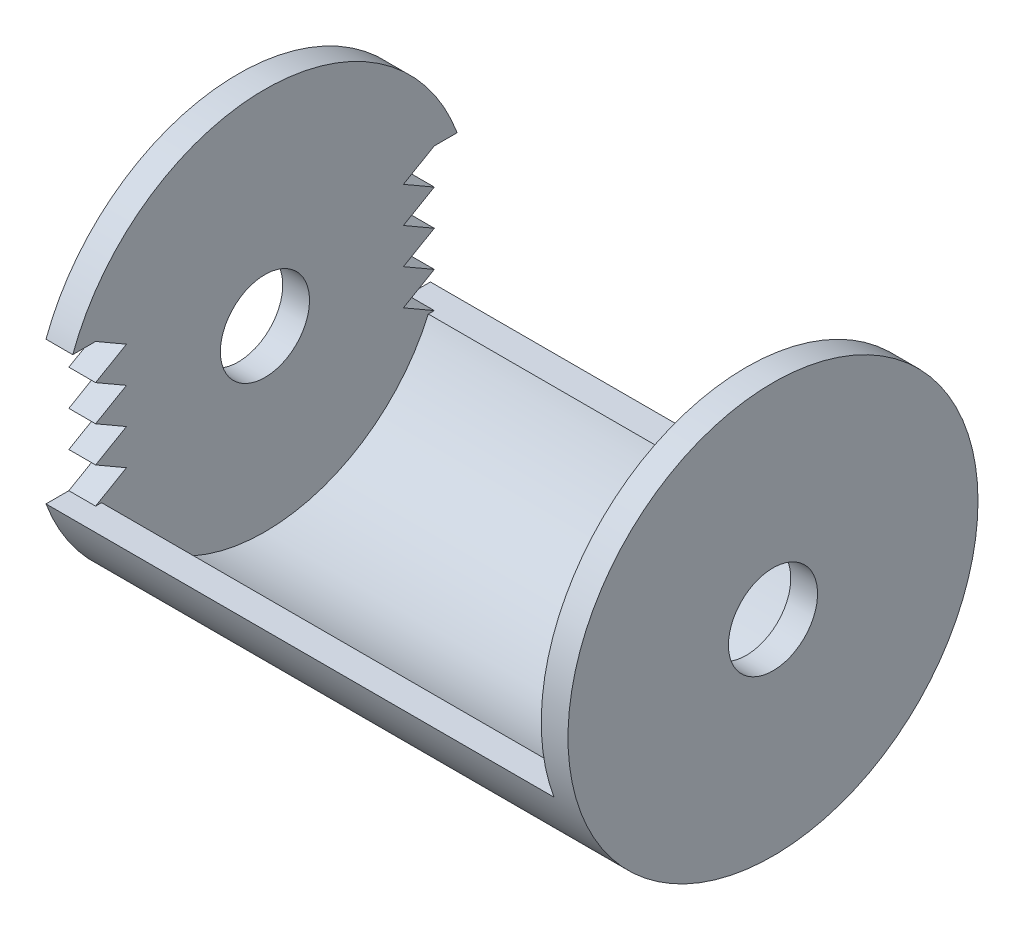
ISO-10303-21;
HEADER;
FILE_DESCRIPTION(('STEP AP214'),'2;1');
FILE_NAME('part.step','',(''),(''),'','','');
FILE_SCHEMA(('AUTOMOTIVE_DESIGN { 1 0 10303 214 1 1 1 1 }'));
ENDSEC;
DATA;
#1=APPLICATION_CONTEXT('core data for automotive mechanical design processes');
#2=APPLICATION_PROTOCOL_DEFINITION('international standard','automotive_design',2000,#1);
#3=PRODUCT_CONTEXT('',#1,'mechanical');
#4=PRODUCT('Part','Part','',(#3));
#5=PRODUCT_RELATED_PRODUCT_CATEGORY('part','',(#4));
#6=PRODUCT_DEFINITION_FORMATION('','',#4);
#7=PRODUCT_DEFINITION_CONTEXT('part definition',#1,'design');
#8=PRODUCT_DEFINITION('design','',#6,#7);
#9=PRODUCT_DEFINITION_SHAPE('','',#8);
#10=(LENGTH_UNIT() NAMED_UNIT(*) SI_UNIT(.MILLI.,.METRE.));
#11=(NAMED_UNIT(*) PLANE_ANGLE_UNIT() SI_UNIT($,.RADIAN.));
#12=(NAMED_UNIT(*) SI_UNIT($,.STERADIAN.) SOLID_ANGLE_UNIT());
#13=UNCERTAINTY_MEASURE_WITH_UNIT(LENGTH_MEASURE(1.E-05),#10,'distance_accuracy_value','');
#14=(GEOMETRIC_REPRESENTATION_CONTEXT(3) GLOBAL_UNCERTAINTY_ASSIGNED_CONTEXT((#13)) GLOBAL_UNIT_ASSIGNED_CONTEXT((#10,
#11,#12)) REPRESENTATION_CONTEXT('',''));
#15=CARTESIAN_POINT('',(0.,0.,0.));
#16=DIRECTION('',(0.,0.,1.));
#17=DIRECTION('',(1.,0.,0.));
#18=AXIS2_PLACEMENT_3D('',#15,#16,#17);
#19=CARTESIAN_POINT('',(0.,0.,0.));
#20=DIRECTION('',(1.,0.,0.));
#21=DIRECTION('',(0.,0.,-1.));
#22=AXIS2_PLACEMENT_3D('',#19,#20,#21);
#23=PLANE('',#22);
#24=CARTESIAN_POINT('',(0.,0.,0.));
#25=DIRECTION('',(1.,0.,0.));
#26=DIRECTION('',(0.,0.,-1.));
#27=AXIS2_PLACEMENT_3D('',#24,#25,#26);
#28=CIRCLE('',#27,6.35);
#29=CARTESIAN_POINT('',(0.,0.,6.35));
#30=VERTEX_POINT('',#29);
#31=EDGE_CURVE('E246',#30,#30,#28,.T.);
#32=ORIENTED_EDGE('',*,*,#31,.T.);
#33=EDGE_LOOP('',(#32));
#34=FACE_BOUND('',#33,.T.);
#35=DIRECTION('',(0.,0.,-1.));
#36=VECTOR('',#35,1.);
#37=CARTESIAN_POINT('',(0.,10.16,29.21));
#38=LINE('',#37,#36);
#39=CARTESIAN_POINT('',(0.,10.16,27.3861004891167));
#40=VERTEX_POINT('',#39);
#41=CARTESIAN_POINT('',(0.,10.16,24.13));
#42=VERTEX_POINT('',#41);
#43=EDGE_CURVE('E210',#40,#42,#38,.T.);
#44=ORIENTED_EDGE('',*,*,#43,.F.);
#45=CARTESIAN_POINT('',(0.,0.,0.));
#46=DIRECTION('',(1.,0.,0.));
#47=DIRECTION('',(0.,0.,-1.));
#48=AXIS2_PLACEMENT_3D('',#45,#46,#47);
#49=CIRCLE('',#48,29.21);
#50=CARTESIAN_POINT('',(0.,10.16,-27.3861004891167));
#51=VERTEX_POINT('',#50);
#52=EDGE_CURVE('E256',#51,#40,#49,.T.);
#53=ORIENTED_EDGE('',*,*,#52,.F.);
#54=DIRECTION('',(0.,0.,-1.));
#55=VECTOR('',#54,1.);
#56=CARTESIAN_POINT('',(0.,10.16,-29.21));
#57=LINE('',#56,#55);
#58=CARTESIAN_POINT('',(0.,10.16,-24.13));
#59=VERTEX_POINT('',#58);
#60=EDGE_CURVE('E308',#59,#51,#57,.T.);
#61=ORIENTED_EDGE('',*,*,#60,.F.);
#62=DIRECTION('',(0.,0.5,-0.866025403784439));
#63=VECTOR('',#62,1.);
#64=CARTESIAN_POINT('',(0.,10.16,-24.13));
#65=LINE('',#64,#63);
#66=CARTESIAN_POINT('',(0.,7.61999999999999,-19.730590948775));
#67=VERTEX_POINT('',#66);
#68=EDGE_CURVE('E402',#67,#59,#65,.T.);
#69=ORIENTED_EDGE('',*,*,#68,.F.);
#70=DIRECTION('',(0.,0.5,0.866025403784439));
#71=VECTOR('',#70,1.);
#72=CARTESIAN_POINT('',(0.,7.61999999999999,-19.730590948775));
#73=LINE('',#72,#71);
#74=CARTESIAN_POINT('',(0.,5.07999999999999,-24.13));
#75=VERTEX_POINT('',#74);
#76=EDGE_CURVE('E404',#75,#67,#73,.T.);
#77=ORIENTED_EDGE('',*,*,#76,.F.);
#78=DIRECTION('',(0.,0.5,-0.866025403784439));
#79=VECTOR('',#78,1.);
#80=CARTESIAN_POINT('',(0.,5.07999999999999,-24.13));
#81=LINE('',#80,#79);
#82=CARTESIAN_POINT('',(0.,2.53999999999999,-19.730590948775));
#83=VERTEX_POINT('',#82);
#84=EDGE_CURVE('E406',#83,#75,#81,.T.);
#85=ORIENTED_EDGE('',*,*,#84,.F.);
#86=DIRECTION('',(0.,0.5,0.866025403784439));
#87=VECTOR('',#86,1.);
#88=CARTESIAN_POINT('',(0.,2.53999999999999,-19.730590948775));
#89=LINE('',#88,#87);
#90=CARTESIAN_POINT('',(0.,0.,-24.13));
#91=VERTEX_POINT('',#90);
#92=EDGE_CURVE('E407',#91,#83,#89,.T.);
#93=ORIENTED_EDGE('',*,*,#92,.F.);
#94=DIRECTION('',(0.,0.499999999999999,-0.866025403784439));
#95=VECTOR('',#94,1.);
#96=CARTESIAN_POINT('',(0.,0.,-24.13));
#97=LINE('',#96,#95);
#98=CARTESIAN_POINT('',(0.,-2.54,-19.730590948775));
#99=VERTEX_POINT('',#98);
#100=EDGE_CURVE('E414',#99,#91,#97,.T.);
#101=ORIENTED_EDGE('',*,*,#100,.F.);
#102=DIRECTION('',(0.,0.5,0.866025403784439));
#103=VECTOR('',#102,1.);
#104=CARTESIAN_POINT('',(0.,-2.54,-19.730590948775));
#105=LINE('',#104,#103);
#106=CARTESIAN_POINT('',(0.,-5.08,-24.13));
#107=VERTEX_POINT('',#106);
#108=EDGE_CURVE('E418',#107,#99,#105,.T.);
#109=ORIENTED_EDGE('',*,*,#108,.F.);
#110=DIRECTION('',(0.,0.5,-0.866025403784439));
#111=VECTOR('',#110,1.);
#112=CARTESIAN_POINT('',(0.,-5.08,-24.13));
#113=LINE('',#112,#111);
#114=CARTESIAN_POINT('',(0.,-7.62,-19.730590948775));
#115=VERTEX_POINT('',#114);
#116=EDGE_CURVE('E282',#115,#107,#113,.T.);
#117=ORIENTED_EDGE('',*,*,#116,.F.);
#118=DIRECTION('',(0.,0.5,0.866025403784439));
#119=VECTOR('',#118,1.);
#120=CARTESIAN_POINT('',(0.,-7.62,-19.730590948775));
#121=LINE('',#120,#119);
#122=CARTESIAN_POINT('',(0.,-10.16,-24.13));
#123=VERTEX_POINT('',#122);
#124=EDGE_CURVE('E276',#123,#115,#121,.T.);
#125=ORIENTED_EDGE('',*,*,#124,.F.);
#126=DIRECTION('',(0.,0.,1.));
#127=VECTOR('',#126,1.);
#128=CARTESIAN_POINT('',(0.,-10.16,-24.13));
#129=LINE('',#128,#127);
#130=CARTESIAN_POINT('',(0.,-10.16,-27.3861004891167));
#131=VERTEX_POINT('',#130);
#132=EDGE_CURVE('E267',#131,#123,#129,.T.);
#133=ORIENTED_EDGE('',*,*,#132,.F.);
#134=CARTESIAN_POINT('',(0.,-10.16,27.3861004891167));
#135=VERTEX_POINT('',#134);
#136=EDGE_CURVE('E249',#135,#131,#49,.T.);
#137=ORIENTED_EDGE('',*,*,#136,.F.);
#138=DIRECTION('',(0.,0.,1.));
#139=VECTOR('',#138,1.);
#140=CARTESIAN_POINT('',(0.,-10.16,24.13));
#141=LINE('',#140,#139);
#142=CARTESIAN_POINT('',(0.,-10.16,24.13));
#143=VERTEX_POINT('',#142);
#144=EDGE_CURVE('E219',#143,#135,#141,.T.);
#145=ORIENTED_EDGE('',*,*,#144,.F.);
#146=DIRECTION('',(0.,-0.5,0.866025403784439));
#147=VECTOR('',#146,1.);
#148=CARTESIAN_POINT('',(0.,-7.62,19.7305909487751));
#149=LINE('',#148,#147);
#150=CARTESIAN_POINT('',(0.,-7.62,19.7305909487751));
#151=VERTEX_POINT('',#150);
#152=EDGE_CURVE('E366',#151,#143,#149,.T.);
#153=ORIENTED_EDGE('',*,*,#152,.F.);
#154=DIRECTION('',(0.,-0.5,-0.866025403784439));
#155=VECTOR('',#154,1.);
#156=CARTESIAN_POINT('',(0.,-5.08,24.13));
#157=LINE('',#156,#155);
#158=CARTESIAN_POINT('',(0.,-5.08,24.13));
#159=VERTEX_POINT('',#158);
#160=EDGE_CURVE('E361',#159,#151,#157,.T.);
#161=ORIENTED_EDGE('',*,*,#160,.F.);
#162=DIRECTION('',(0.,-0.5,0.866025403784439));
#163=VECTOR('',#162,1.);
#164=CARTESIAN_POINT('',(0.,-2.54,19.7305909487751));
#165=LINE('',#164,#163);
#166=CARTESIAN_POINT('',(0.,-2.54,19.7305909487751));
#167=VERTEX_POINT('',#166);
#168=EDGE_CURVE('E359',#167,#159,#165,.T.);
#169=ORIENTED_EDGE('',*,*,#168,.F.);
#170=DIRECTION('',(0.,-0.5,-0.866025403784439));
#171=VECTOR('',#170,1.);
#172=CARTESIAN_POINT('',(0.,0.,24.13));
#173=LINE('',#172,#171);
#174=CARTESIAN_POINT('',(0.,0.,24.13));
#175=VERTEX_POINT('',#174);
#176=EDGE_CURVE('E357',#175,#167,#173,.T.);
#177=ORIENTED_EDGE('',*,*,#176,.F.);
#178=DIRECTION('',(0.,-0.5,0.866025403784439));
#179=VECTOR('',#178,1.);
#180=CARTESIAN_POINT('',(0.,2.54,19.7305909487751));
#181=LINE('',#180,#179);
#182=CARTESIAN_POINT('',(0.,2.54,19.7305909487751));
#183=VERTEX_POINT('',#182);
#184=EDGE_CURVE('E355',#183,#175,#181,.T.);
#185=ORIENTED_EDGE('',*,*,#184,.F.);
#186=DIRECTION('',(0.,-0.5,-0.866025403784439));
#187=VECTOR('',#186,1.);
#188=CARTESIAN_POINT('',(0.,5.08,24.13));
#189=LINE('',#188,#187);
#190=CARTESIAN_POINT('',(0.,5.08,24.13));
#191=VERTEX_POINT('',#190);
#192=EDGE_CURVE('E353',#191,#183,#189,.T.);
#193=ORIENTED_EDGE('',*,*,#192,.F.);
#194=DIRECTION('',(0.,-0.5,0.866025403784439));
#195=VECTOR('',#194,1.);
#196=CARTESIAN_POINT('',(0.,7.62,19.7305909487751));
#197=LINE('',#196,#195);
#198=CARTESIAN_POINT('',(0.,7.62,19.7305909487751));
#199=VERTEX_POINT('',#198);
#200=EDGE_CURVE('E349',#199,#191,#197,.T.);
#201=ORIENTED_EDGE('',*,*,#200,.F.);
#202=DIRECTION('',(0.,-0.5,-0.866025403784439));
#203=VECTOR('',#202,1.);
#204=CARTESIAN_POINT('',(0.,10.16,24.13));
#205=LINE('',#204,#203);
#206=EDGE_CURVE('E278',#42,#199,#205,.T.);
#207=ORIENTED_EDGE('',*,*,#206,.F.);
#208=EDGE_LOOP('',(#44,#53,#61,#69,#77,#85,#93,#101,#109,#117,#125,#133,#137,#145,#153,#161,
#169,#177,#185,#193,#201,#207));
#209=FACE_BOUND('',#208,.T.);
#210=ADVANCED_FACE('F41',(#34,#209),#23,.F.);
#211=CARTESIAN_POINT('',(76.2,0.,0.));
#212=DIRECTION('',(-1.,0.,0.));
#213=DIRECTION('',(0.,0.,1.));
#214=AXIS2_PLACEMENT_3D('',#211,#212,#213);
#215=CYLINDRICAL_SURFACE('',#214,29.21);
#216=ORIENTED_EDGE('',*,*,#52,.T.);
#217=DIRECTION('',(-1.,0.,0.));
#218=VECTOR('',#217,1.);
#219=CARTESIAN_POINT('',(76.2,10.16,27.3861004891167));
#220=LINE('',#219,#218);
#221=CARTESIAN_POINT('',(3.81,10.16,27.3861004891167));
#222=VERTEX_POINT('',#221);
#223=EDGE_CURVE('E311',#40,#222,#220,.F.);
#224=ORIENTED_EDGE('',*,*,#223,.T.);
#225=CARTESIAN_POINT('',(3.81000000000001,0.,0.));
#226=DIRECTION('',(-1.,0.,0.));
#227=DIRECTION('',(0.,-1.,0.));
#228=AXIS2_PLACEMENT_3D('',#225,#226,#227);
#229=CIRCLE('',#228,29.21);
#230=CARTESIAN_POINT('',(3.81,10.16,-27.3861004891167));
#231=VERTEX_POINT('',#230);
#232=EDGE_CURVE('E221',#222,#231,#229,.T.);
#233=ORIENTED_EDGE('',*,*,#232,.T.);
#234=DIRECTION('',(-1.,0.,0.));
#235=VECTOR('',#234,1.);
#236=CARTESIAN_POINT('',(76.2,10.16,-27.3861004891167));
#237=LINE('',#236,#235);
#238=EDGE_CURVE('E307',#231,#51,#237,.T.);
#239=ORIENTED_EDGE('',*,*,#238,.T.);
#240=EDGE_LOOP('',(#216,#224,#233,#239));
#241=FACE_BOUND('',#240,.T.);
#242=ADVANCED_FACE('F442',(#241),#215,.T.);
#243=CARTESIAN_POINT('',(3.81,-10.16,-29.21));
#244=DIRECTION('',(0.,-1.,0.));
#245=DIRECTION('',(0.,0.,-1.));
#246=AXIS2_PLACEMENT_3D('',#243,#244,#245);
#247=PLANE('',#246);
#248=DIRECTION('',(0.,0.,1.));
#249=VECTOR('',#248,1.);
#250=CARTESIAN_POINT('',(72.39,-10.16,-29.21));
#251=LINE('',#250,#249);
#252=CARTESIAN_POINT('',(72.39,-10.16,23.2794845303757));
#253=VERTEX_POINT('',#252);
#254=CARTESIAN_POINT('',(72.39,-10.16,27.3861004891167));
#255=VERTEX_POINT('',#254);
#256=EDGE_CURVE('E323',#253,#255,#251,.T.);
#257=ORIENTED_EDGE('',*,*,#256,.F.);
#258=DIRECTION('',(-1.,0.,0.));
#259=VECTOR('',#258,1.);
#260=CARTESIAN_POINT('',(76.2,-10.16,23.2794845303757));
#261=LINE('',#260,#259);
#262=CARTESIAN_POINT('',(3.81000000000001,-10.16,23.2794845303757));
#263=VERTEX_POINT('',#262);
#264=EDGE_CURVE('E320',#253,#263,#261,.T.);
#265=ORIENTED_EDGE('',*,*,#264,.T.);
#266=DIRECTION('',(0.,0.,1.));
#267=VECTOR('',#266,1.);
#268=CARTESIAN_POINT('',(3.81,-10.16,-29.21));
#269=LINE('',#268,#267);
#270=CARTESIAN_POINT('',(3.81,-10.16,24.13));
#271=VERTEX_POINT('',#270);
#272=EDGE_CURVE('E321',#263,#271,#269,.T.);
#273=ORIENTED_EDGE('',*,*,#272,.T.);
#274=DIRECTION('',(-1.,0.,0.));
#275=VECTOR('',#274,1.);
#276=CARTESIAN_POINT('',(3.81,-10.16,24.13));
#277=LINE('',#276,#275);
#278=EDGE_CURVE('E315',#271,#143,#277,.T.);
#279=ORIENTED_EDGE('',*,*,#278,.T.);
#280=ORIENTED_EDGE('',*,*,#144,.T.);
#281=DIRECTION('',(-1.,0.,0.));
#282=VECTOR('',#281,1.);
#283=CARTESIAN_POINT('',(76.2,-10.16,27.3861004891167));
#284=LINE('',#283,#282);
#285=EDGE_CURVE('E259',#255,#135,#284,.T.);
#286=ORIENTED_EDGE('',*,*,#285,.F.);
#287=EDGE_LOOP('',(#257,#265,#273,#279,#280,#286));
#288=FACE_BOUND('',#287,.T.);
#289=ADVANCED_FACE('F333',(#288),#247,.F.);
#290=CARTESIAN_POINT('',(76.2,0.,0.));
#291=DIRECTION('',(-1.,0.,0.));
#292=DIRECTION('',(0.,0.,1.));
#293=AXIS2_PLACEMENT_3D('',#290,#291,#292);
#294=CYLINDRICAL_SURFACE('',#293,6.35);
#295=CARTESIAN_POINT('',(72.39,0.,0.));
#296=DIRECTION('',(1.,0.,0.));
#297=DIRECTION('',(0.,0.,-1.));
#298=AXIS2_PLACEMENT_3D('',#295,#296,#297);
#299=CIRCLE('',#298,6.35);
#300=CARTESIAN_POINT('',(72.39,0.,6.35));
#301=VERTEX_POINT('',#300);
#302=EDGE_CURVE('E233',#301,#301,#299,.T.);
#303=CARTESIAN_POINT('',(76.2,0.,0.));
#304=DIRECTION('',(1.,0.,0.));
#305=DIRECTION('',(0.,0.,-1.));
#306=AXIS2_PLACEMENT_3D('',#303,#304,#305);
#307=CIRCLE('',#306,6.35);
#308=CARTESIAN_POINT('',(76.2,0.,6.35));
#309=VERTEX_POINT('',#308);
#310=EDGE_CURVE('E250',#309,#309,#307,.T.);
#311=CARTESIAN_POINT('',(72.39,0.,6.35));
#312=CARTESIAN_POINT('',(72.4296875,0.,6.35));
#313=CARTESIAN_POINT('',(72.469375,0.,6.35));
#314=CARTESIAN_POINT('',(72.54875,0.,6.35));
#315=CARTESIAN_POINT('',(72.5884375,0.,6.35));
#316=CARTESIAN_POINT('',(72.6678125,0.,6.35));
#317=CARTESIAN_POINT('',(72.7075,0.,6.35));
#318=CARTESIAN_POINT('',(72.786875,0.,6.35));
#319=CARTESIAN_POINT('',(72.8265625,0.,6.35));
#320=CARTESIAN_POINT('',(72.9059375,0.,6.35));
#321=CARTESIAN_POINT('',(72.945625,0.,6.35));
#322=CARTESIAN_POINT('',(73.025,0.,6.35));
#323=CARTESIAN_POINT('',(73.0646875,0.,6.35));
#324=CARTESIAN_POINT('',(73.1440625,0.,6.35));
#325=CARTESIAN_POINT('',(73.18375,0.,6.35));
#326=CARTESIAN_POINT('',(73.263125,0.,6.35));
#327=CARTESIAN_POINT('',(73.3028125,0.,6.35));
#328=CARTESIAN_POINT('',(73.3821875,0.,6.35));
#329=CARTESIAN_POINT('',(73.421875,0.,6.35));
#330=CARTESIAN_POINT('',(73.50125,0.,6.35));
#331=CARTESIAN_POINT('',(73.5409375,0.,6.35));
#332=CARTESIAN_POINT('',(73.6203125,0.,6.35));
#333=CARTESIAN_POINT('',(73.66,0.,6.35));
#334=CARTESIAN_POINT('',(73.739375,0.,6.35));
#335=CARTESIAN_POINT('',(73.7790625,0.,6.35));
#336=CARTESIAN_POINT('',(73.8584375,0.,6.35));
#337=CARTESIAN_POINT('',(73.898125,0.,6.35));
#338=CARTESIAN_POINT('',(73.9775,0.,6.35));
#339=CARTESIAN_POINT('',(74.0171875,0.,6.35));
#340=CARTESIAN_POINT('',(74.0965625,0.,6.35));
#341=CARTESIAN_POINT('',(74.13625,0.,6.35));
#342=CARTESIAN_POINT('',(74.215625,0.,6.35));
#343=CARTESIAN_POINT('',(74.2553125,0.,6.35));
#344=CARTESIAN_POINT('',(74.3346875,0.,6.35));
#345=CARTESIAN_POINT('',(74.374375,0.,6.35));
#346=CARTESIAN_POINT('',(74.45375,0.,6.35));
#347=CARTESIAN_POINT('',(74.4934375,0.,6.35));
#348=CARTESIAN_POINT('',(74.5728125,0.,6.35));
#349=CARTESIAN_POINT('',(74.6125,0.,6.35));
#350=CARTESIAN_POINT('',(74.691875,0.,6.35));
#351=CARTESIAN_POINT('',(74.7315625,0.,6.35));
#352=CARTESIAN_POINT('',(74.8109375,0.,6.35));
#353=CARTESIAN_POINT('',(74.850625,0.,6.35));
#354=CARTESIAN_POINT('',(74.93,0.,6.35));
#355=CARTESIAN_POINT('',(74.9696875,0.,6.35));
#356=CARTESIAN_POINT('',(75.0490625,0.,6.35));
#357=CARTESIAN_POINT('',(75.08875,0.,6.35));
#358=CARTESIAN_POINT('',(75.168125,0.,6.35));
#359=CARTESIAN_POINT('',(75.2078125,0.,6.35));
#360=CARTESIAN_POINT('',(75.2871875,0.,6.35));
#361=CARTESIAN_POINT('',(75.326875,0.,6.35));
#362=CARTESIAN_POINT('',(75.40625,0.,6.35));
#363=CARTESIAN_POINT('',(75.4459375,0.,6.35));
#364=CARTESIAN_POINT('',(75.5253125,0.,6.35));
#365=CARTESIAN_POINT('',(75.565,0.,6.35));
#366=CARTESIAN_POINT('',(75.644375,0.,6.35));
#367=CARTESIAN_POINT('',(75.6840625,0.,6.35));
#368=CARTESIAN_POINT('',(75.7634375,0.,6.35));
#369=CARTESIAN_POINT('',(75.803125,0.,6.35));
#370=CARTESIAN_POINT('',(75.8825,0.,6.35));
#371=CARTESIAN_POINT('',(75.9221875,0.,6.35));
#372=CARTESIAN_POINT('',(76.0015625,0.,6.35));
#373=CARTESIAN_POINT('',(76.04125,0.,6.35));
#374=CARTESIAN_POINT('',(76.120625,0.,6.35));
#375=CARTESIAN_POINT('',(76.1603125,0.,6.35));
#376=CARTESIAN_POINT('',(76.2,0.,6.35));
#377=B_SPLINE_CURVE_WITH_KNOTS('',3,(#311,#312,#313,#314,#315,#316,#317,#318,#319,#320,#321,
#322,#323,#324,#325,#326,#327,#328,#329,#330,#331,#332,#333,#334,#335,#336,#337,#338,#339,#340,
#341,#342,#343,#344,#345,#346,#347,#348,#349,#350,#351,#352,#353,#354,#355,#356,#357,#358,#359,
#360,#361,#362,#363,#364,#365,#366,#367,#368,#369,#370,#371,#372,#373,#374,#375,#376),
.UNSPECIFIED.,.F.,.F.,(4,2,2,2,2,2,2,2,2,2,2,2,2,2,2,2,2,2,2,2,2,2,2,2,2,2,2,2,2,2,2,2,4),(0.,
0.119062499999989,0.238124999999992,0.357187499999995,0.476249999999998,0.5953125,
0.714374999999989,0.833437499999992,0.952499999999995,1.0715625,1.190625,1.30968749999999,
1.42874999999999,1.5478125,1.666875,1.7859375,1.905,2.02406249999999,2.143125,2.2621875,2.38125,
2.5003125,2.61937499999999,2.7384375,2.8575,2.9765625,3.095625,3.21468749999999,3.33375,
3.4528125,3.571875,3.6909375,3.81000000000001),.UNSPECIFIED.);
#378=EDGE_CURVE('BSEAM455',#301,#309,#377,.T.);
#379=ORIENTED_EDGE('',*,*,#302,.F.);
#380=ORIENTED_EDGE('',*,*,#310,.T.);
#381=ORIENTED_EDGE('',*,*,#378,.T.);
#382=ORIENTED_EDGE('',*,*,#378,.F.);
#383=EDGE_LOOP('',(#379,#381,#380,#382));
#384=FACE_BOUND('',#383,.T.);
#385=ADVANCED_FACE('F455',(#384),#294,.F.);
#386=CARTESIAN_POINT('',(76.2,0.,0.));
#387=DIRECTION('',(1.,0.,0.));
#388=DIRECTION('',(0.,0.,-1.));
#389=AXIS2_PLACEMENT_3D('',#386,#387,#388);
#390=PLANE('',#389);
#391=CARTESIAN_POINT('',(76.2,0.,0.));
#392=DIRECTION('',(1.,0.,0.));
#393=DIRECTION('',(0.,0.,-1.));
#394=AXIS2_PLACEMENT_3D('',#391,#392,#393);
#395=CIRCLE('',#394,29.21);
#396=CARTESIAN_POINT('',(76.2,0.,-29.21));
#397=VERTEX_POINT('',#396);
#398=EDGE_CURVE('E254',#397,#397,#395,.T.);
#399=ORIENTED_EDGE('',*,*,#398,.T.);
#400=EDGE_LOOP('',(#399));
#401=FACE_BOUND('',#400,.T.);
#402=ORIENTED_EDGE('',*,*,#310,.F.);
#403=EDGE_LOOP('',(#402));
#404=FACE_BOUND('',#403,.T.);
#405=ADVANCED_FACE('F448',(#401,#404),#390,.T.);
#406=ORIENTED_EDGE('',*,*,#398,.F.);
#407=EDGE_LOOP('',(#406));
#408=FACE_BOUND('',#407,.T.);
#409=ORIENTED_EDGE('',*,*,#285,.T.);
#410=ORIENTED_EDGE('',*,*,#136,.T.);
#411=DIRECTION('',(-1.,0.,0.));
#412=VECTOR('',#411,1.);
#413=CARTESIAN_POINT('',(76.2,-10.16,-27.3861004891167));
#414=LINE('',#413,#412);
#415=CARTESIAN_POINT('',(72.39,-10.16,-27.3861004891167));
#416=VERTEX_POINT('',#415);
#417=EDGE_CURVE('E44',#131,#416,#414,.F.);
#418=ORIENTED_EDGE('',*,*,#417,.T.);
#419=CARTESIAN_POINT('',(72.39,0.,0.));
#420=DIRECTION('',(1.,0.,0.));
#421=DIRECTION('',(0.,0.,-1.));
#422=AXIS2_PLACEMENT_3D('',#419,#420,#421);
#423=CIRCLE('',#422,29.21);
#424=EDGE_CURVE('E232',#416,#255,#423,.T.);
#425=ORIENTED_EDGE('',*,*,#424,.T.);
#426=EDGE_LOOP('',(#409,#410,#418,#425));
#427=FACE_BOUND('',#426,.T.);
#428=ADVANCED_FACE('F43',(#408,#427),#215,.T.);
#429=CARTESIAN_POINT('',(3.81000000000001,0.,0.));
#430=DIRECTION('',(-1.,0.,0.));
#431=DIRECTION('',(0.,-1.,0.));
#432=AXIS2_PLACEMENT_3D('',#429,#430,#431);
#433=CIRCLE('',#432,6.35);
#434=CARTESIAN_POINT('',(3.81000000000001,0.,6.35));
#435=VERTEX_POINT('',#434);
#436=EDGE_CURVE('E235',#435,#435,#433,.T.);
#437=CARTESIAN_POINT('',(3.81000000000001,0.,6.35));
#438=CARTESIAN_POINT('',(3.77031250000001,0.,6.35));
#439=CARTESIAN_POINT('',(3.73062500000001,0.,6.35));
#440=CARTESIAN_POINT('',(3.65125,0.,6.35));
#441=CARTESIAN_POINT('',(3.6115625,0.,6.35));
#442=CARTESIAN_POINT('',(3.53218750000001,0.,6.35));
#443=CARTESIAN_POINT('',(3.49250000000001,0.,6.35));
#444=CARTESIAN_POINT('',(3.41312500000001,0.,6.35));
#445=CARTESIAN_POINT('',(3.37343750000001,0.,6.35));
#446=CARTESIAN_POINT('',(3.29406250000001,0.,6.35));
#447=CARTESIAN_POINT('',(3.25437500000001,0.,6.35));
#448=CARTESIAN_POINT('',(3.17500000000001,0.,6.35));
#449=CARTESIAN_POINT('',(3.13531250000001,0.,6.35));
#450=CARTESIAN_POINT('',(3.0559375,0.,6.35));
#451=CARTESIAN_POINT('',(3.01625,0.,6.35));
#452=CARTESIAN_POINT('',(2.93687500000001,0.,6.35));
#453=CARTESIAN_POINT('',(2.89718750000001,0.,6.35));
#454=CARTESIAN_POINT('',(2.81781250000001,0.,6.35));
#455=CARTESIAN_POINT('',(2.77812500000001,0.,6.35));
#456=CARTESIAN_POINT('',(2.69875000000001,0.,6.35));
#457=CARTESIAN_POINT('',(2.65906250000001,0.,6.35));
#458=CARTESIAN_POINT('',(2.57968750000001,0.,6.35));
#459=CARTESIAN_POINT('',(2.54000000000001,0.,6.35));
#460=CARTESIAN_POINT('',(2.460625,0.,6.35));
#461=CARTESIAN_POINT('',(2.4209375,0.,6.35));
#462=CARTESIAN_POINT('',(2.3415625,0.,6.35));
#463=CARTESIAN_POINT('',(2.301875,0.,6.35));
#464=CARTESIAN_POINT('',(2.2225,0.,6.35));
#465=CARTESIAN_POINT('',(2.18281250000001,0.,6.35));
#466=CARTESIAN_POINT('',(2.10343750000001,0.,6.35));
#467=CARTESIAN_POINT('',(2.06375000000001,0.,6.35));
#468=CARTESIAN_POINT('',(1.98437500000001,0.,6.35));
#469=CARTESIAN_POINT('',(1.9446875,0.,6.35));
#470=CARTESIAN_POINT('',(1.8653125,0.,6.35));
#471=CARTESIAN_POINT('',(1.825625,0.,6.35));
#472=CARTESIAN_POINT('',(1.74625,0.,6.35));
#473=CARTESIAN_POINT('',(1.7065625,0.,6.35));
#474=CARTESIAN_POINT('',(1.6271875,0.,6.35));
#475=CARTESIAN_POINT('',(1.58750000000001,0.,6.35));
#476=CARTESIAN_POINT('',(1.50812500000001,0.,6.35));
#477=CARTESIAN_POINT('',(1.46843750000001,0.,6.35));
#478=CARTESIAN_POINT('',(1.38906250000001,0.,6.35));
#479=CARTESIAN_POINT('',(1.349375,0.,6.35));
#480=CARTESIAN_POINT('',(1.27,0.,6.35));
#481=CARTESIAN_POINT('',(1.2303125,0.,6.35));
#482=CARTESIAN_POINT('',(1.1509375,0.,6.35));
#483=CARTESIAN_POINT('',(1.11125,0.,6.35));
#484=CARTESIAN_POINT('',(1.031875,0.,6.35));
#485=CARTESIAN_POINT('',(0.992187499999996,0.,6.35));
#486=CARTESIAN_POINT('',(0.912812499999999,0.,6.35));
#487=CARTESIAN_POINT('',(0.873125000000002,0.,6.35));
#488=CARTESIAN_POINT('',(0.793750000000005,0.,6.35));
#489=CARTESIAN_POINT('',(0.754062500000004,0.,6.35));
#490=CARTESIAN_POINT('',(0.674687500000002,0.,6.35));
#491=CARTESIAN_POINT('',(0.635000000000001,0.,6.35));
#492=CARTESIAN_POINT('',(0.555624999999999,0.,6.35));
#493=CARTESIAN_POINT('',(0.515937499999998,0.,6.35));
#494=CARTESIAN_POINT('',(0.436562499999997,0.,6.35));
#495=CARTESIAN_POINT('',(0.396874999999996,0.,6.35));
#496=CARTESIAN_POINT('',(0.317499999999998,0.,6.35));
#497=CARTESIAN_POINT('',(0.277812500000002,0.,6.35));
#498=CARTESIAN_POINT('',(0.198437500000005,0.,6.35));
#499=CARTESIAN_POINT('',(0.158750000000004,0.,6.35));
#500=CARTESIAN_POINT('',(0.0793750000000019,0.,6.35));
#501=CARTESIAN_POINT('',(0.039687500000001,0.,6.35));
#502=CARTESIAN_POINT('',(0.,0.,6.35));
#503=B_SPLINE_CURVE_WITH_KNOTS('',3,(#437,#438,#439,#440,#441,#442,#443,#444,#445,#446,#447,
#448,#449,#450,#451,#452,#453,#454,#455,#456,#457,#458,#459,#460,#461,#462,#463,#464,#465,#466,
#467,#468,#469,#470,#471,#472,#473,#474,#475,#476,#477,#478,#479,#480,#481,#482,#483,#484,#485,
#486,#487,#488,#489,#490,#491,#492,#493,#494,#495,#496,#497,#498,#499,#500,#501,#502),
.UNSPECIFIED.,.F.,.F.,(4,2,2,2,2,2,2,2,2,2,2,2,2,2,2,2,2,2,2,2,2,2,2,2,2,2,2,2,2,2,2,2,4),(0.,
0.119062500000003,0.238125000000006,0.357187499999995,0.476249999999998,0.5953125,
0.714375000000003,0.833437500000006,0.952499999999995,1.0715625,1.190625,1.3096875,
1.42875000000001,1.54781250000001,1.666875,1.7859375,1.905,2.02406250000001,2.14312500000001,
2.2621875,2.38125,2.5003125,2.61937500000001,2.73843750000001,2.85750000000001,2.9765625,
3.095625,3.21468750000001,3.33375000000001,3.45281250000001,3.571875,3.6909375,
3.81000000000001),.UNSPECIFIED.);
#504=EDGE_CURVE('BSEAM452',#435,#30,#503,.T.);
#505=ORIENTED_EDGE('',*,*,#436,.F.);
#506=ORIENTED_EDGE('',*,*,#31,.F.);
#507=ORIENTED_EDGE('',*,*,#504,.T.);
#508=ORIENTED_EDGE('',*,*,#504,.F.);
#509=EDGE_LOOP('',(#505,#507,#506,#508));
#510=FACE_BOUND('',#509,.T.);
#511=ADVANCED_FACE('F452',(#510),#294,.F.);
#512=ORIENTED_EDGE('',*,*,#417,.F.);
#513=ORIENTED_EDGE('',*,*,#132,.T.);
#514=DIRECTION('',(-1.,0.,0.));
#515=VECTOR('',#514,1.);
#516=CARTESIAN_POINT('',(3.81,-10.16,-24.13));
#517=LINE('',#516,#515);
#518=CARTESIAN_POINT('',(3.81,-10.16,-24.13));
#519=VERTEX_POINT('',#518);
#520=EDGE_CURVE('E289',#519,#123,#517,.T.);
#521=ORIENTED_EDGE('',*,*,#520,.F.);
#522=CARTESIAN_POINT('',(3.81,-10.16,-23.2794845303757));
#523=VERTEX_POINT('',#522);
#524=EDGE_CURVE('E245',#519,#523,#269,.T.);
#525=ORIENTED_EDGE('',*,*,#524,.T.);
#526=DIRECTION('',(-1.,0.,0.));
#527=VECTOR('',#526,1.);
#528=CARTESIAN_POINT('',(0.,-10.16,-23.2794845303757));
#529=LINE('',#528,#527);
#530=CARTESIAN_POINT('',(72.39,-10.16,-23.2794845303757));
#531=VERTEX_POINT('',#530);
#532=EDGE_CURVE('E318',#523,#531,#529,.F.);
#533=ORIENTED_EDGE('',*,*,#532,.T.);
#534=EDGE_CURVE('E238',#416,#531,#251,.T.);
#535=ORIENTED_EDGE('',*,*,#534,.F.);
#536=EDGE_LOOP('',(#512,#513,#521,#525,#533,#535));
#537=FACE_BOUND('',#536,.T.);
#538=ADVANCED_FACE('F269',(#537),#247,.F.);
#539=CARTESIAN_POINT('',(72.39,68.58,-29.21));
#540=DIRECTION('',(1.,0.,0.));
#541=DIRECTION('',(0.,0.,-1.));
#542=AXIS2_PLACEMENT_3D('',#539,#540,#541);
#543=PLANE('',#542);
#544=ORIENTED_EDGE('',*,*,#302,.T.);
#545=EDGE_LOOP('',(#544));
#546=FACE_BOUND('',#545,.T.);
#547=ORIENTED_EDGE('',*,*,#424,.F.);
#548=ORIENTED_EDGE('',*,*,#534,.T.);
#549=CARTESIAN_POINT('',(72.39,0.,0.));
#550=DIRECTION('',(1.,0.,0.));
#551=DIRECTION('',(0.,0.,-1.));
#552=AXIS2_PLACEMENT_3D('',#549,#550,#551);
#553=CIRCLE('',#552,25.4);
#554=EDGE_CURVE('E314',#253,#531,#553,.T.);
#555=ORIENTED_EDGE('',*,*,#554,.F.);
#556=ORIENTED_EDGE('',*,*,#256,.T.);
#557=EDGE_LOOP('',(#547,#548,#555,#556));
#558=FACE_BOUND('',#557,.T.);
#559=ADVANCED_FACE('F456',(#546,#558),#543,.F.);
#560=CARTESIAN_POINT('',(3.80999999999999,68.58,-29.21));
#561=DIRECTION('',(-1.,0.,0.));
#562=DIRECTION('',(0.,-1.,0.));
#563=AXIS2_PLACEMENT_3D('',#560,#561,#562);
#564=PLANE('',#563);
#565=ORIENTED_EDGE('',*,*,#232,.F.);
#566=DIRECTION('',(0.,0.,-1.));
#567=VECTOR('',#566,1.);
#568=CARTESIAN_POINT('',(3.81,10.16,29.21));
#569=LINE('',#568,#567);
#570=CARTESIAN_POINT('',(3.81,10.16,24.13));
#571=VERTEX_POINT('',#570);
#572=EDGE_CURVE('E11',#222,#571,#569,.T.);
#573=ORIENTED_EDGE('',*,*,#572,.T.);
#574=DIRECTION('',(0.,-0.5,-0.866025403784439));
#575=VECTOR('',#574,1.);
#576=CARTESIAN_POINT('',(3.81,10.16,24.13));
#577=LINE('',#576,#575);
#578=CARTESIAN_POINT('',(3.81,7.62,19.7305909487751));
#579=VERTEX_POINT('',#578);
#580=EDGE_CURVE('E212',#571,#579,#577,.T.);
#581=ORIENTED_EDGE('',*,*,#580,.T.);
#582=DIRECTION('',(0.,-0.5,0.866025403784439));
#583=VECTOR('',#582,1.);
#584=CARTESIAN_POINT('',(3.81,7.62,19.7305909487751));
#585=LINE('',#584,#583);
#586=CARTESIAN_POINT('',(3.81,5.08,24.13));
#587=VERTEX_POINT('',#586);
#588=EDGE_CURVE('E60',#579,#587,#585,.T.);
#589=ORIENTED_EDGE('',*,*,#588,.T.);
#590=DIRECTION('',(0.,-0.5,-0.866025403784439));
#591=VECTOR('',#590,1.);
#592=CARTESIAN_POINT('',(3.81,5.08,24.13));
#593=LINE('',#592,#591);
#594=CARTESIAN_POINT('',(3.81,2.54,19.7305909487751));
#595=VERTEX_POINT('',#594);
#596=EDGE_CURVE('E599',#587,#595,#593,.T.);
#597=ORIENTED_EDGE('',*,*,#596,.T.);
#598=DIRECTION('',(0.,-0.5,0.866025403784439));
#599=VECTOR('',#598,1.);
#600=CARTESIAN_POINT('',(3.81,2.54,19.7305909487751));
#601=LINE('',#600,#599);
#602=CARTESIAN_POINT('',(3.81,0.,24.13));
#603=VERTEX_POINT('',#602);
#604=EDGE_CURVE('E604',#595,#603,#601,.T.);
#605=ORIENTED_EDGE('',*,*,#604,.T.);
#606=DIRECTION('',(0.,-0.5,-0.866025403784439));
#607=VECTOR('',#606,1.);
#608=CARTESIAN_POINT('',(3.81,0.,24.13));
#609=LINE('',#608,#607);
#610=CARTESIAN_POINT('',(3.81,-2.54,19.7305909487751));
#611=VERTEX_POINT('',#610);
#612=EDGE_CURVE('E607',#603,#611,#609,.T.);
#613=ORIENTED_EDGE('',*,*,#612,.T.);
#614=DIRECTION('',(0.,-0.5,0.866025403784439));
#615=VECTOR('',#614,1.);
#616=CARTESIAN_POINT('',(3.81,-2.54,19.7305909487751));
#617=LINE('',#616,#615);
#618=CARTESIAN_POINT('',(3.81,-5.08,24.13));
#619=VERTEX_POINT('',#618);
#620=EDGE_CURVE('E345',#611,#619,#617,.T.);
#621=ORIENTED_EDGE('',*,*,#620,.T.);
#622=DIRECTION('',(0.,-0.5,-0.866025403784439));
#623=VECTOR('',#622,1.);
#624=CARTESIAN_POINT('',(3.81,-5.08,24.13));
#625=LINE('',#624,#623);
#626=CARTESIAN_POINT('',(3.81,-7.62,19.7305909487751));
#627=VERTEX_POINT('',#626);
#628=EDGE_CURVE('E338',#619,#627,#625,.T.);
#629=ORIENTED_EDGE('',*,*,#628,.T.);
#630=DIRECTION('',(0.,-0.5,0.866025403784439));
#631=VECTOR('',#630,1.);
#632=CARTESIAN_POINT('',(3.81,-7.62,19.7305909487751));
#633=LINE('',#632,#631);
#634=EDGE_CURVE('E211',#627,#271,#633,.T.);
#635=ORIENTED_EDGE('',*,*,#634,.T.);
#636=ORIENTED_EDGE('',*,*,#272,.F.);
#637=CARTESIAN_POINT('',(3.80999999999999,0.,0.));
#638=DIRECTION('',(1.,0.,0.));
#639=DIRECTION('',(0.,0.,-1.));
#640=AXIS2_PLACEMENT_3D('',#637,#638,#639);
#641=CIRCLE('',#640,25.4);
#642=EDGE_CURVE('E313',#263,#523,#641,.T.);
#643=ORIENTED_EDGE('',*,*,#642,.T.);
#644=ORIENTED_EDGE('',*,*,#524,.F.);
#645=DIRECTION('',(0.,0.5,0.866025403784439));
#646=VECTOR('',#645,1.);
#647=CARTESIAN_POINT('',(3.81,-7.62,-19.730590948775));
#648=LINE('',#647,#646);
#649=CARTESIAN_POINT('',(3.81,-7.62,-19.730590948775));
#650=VERTEX_POINT('',#649);
#651=EDGE_CURVE('E304',#519,#650,#648,.T.);
#652=ORIENTED_EDGE('',*,*,#651,.T.);
#653=DIRECTION('',(0.,0.5,-0.866025403784439));
#654=VECTOR('',#653,1.);
#655=CARTESIAN_POINT('',(3.81,-5.08,-24.13));
#656=LINE('',#655,#654);
#657=CARTESIAN_POINT('',(3.81,-5.08,-24.13));
#658=VERTEX_POINT('',#657);
#659=EDGE_CURVE('E305',#650,#658,#656,.T.);
#660=ORIENTED_EDGE('',*,*,#659,.T.);
#661=DIRECTION('',(0.,0.5,0.866025403784439));
#662=VECTOR('',#661,1.);
#663=CARTESIAN_POINT('',(3.81,-2.54,-19.730590948775));
#664=LINE('',#663,#662);
#665=CARTESIAN_POINT('',(3.81,-2.54,-19.730590948775));
#666=VERTEX_POINT('',#665);
#667=EDGE_CURVE('E62',#658,#666,#664,.T.);
#668=ORIENTED_EDGE('',*,*,#667,.T.);
#669=DIRECTION('',(0.,0.499999999999999,-0.866025403784439));
#670=VECTOR('',#669,1.);
#671=CARTESIAN_POINT('',(3.81,0.,-24.13));
#672=LINE('',#671,#670);
#673=CARTESIAN_POINT('',(3.81,0.,-24.13));
#674=VERTEX_POINT('',#673);
#675=EDGE_CURVE('E296',#666,#674,#672,.T.);
#676=ORIENTED_EDGE('',*,*,#675,.T.);
#677=DIRECTION('',(0.,0.5,0.866025403784439));
#678=VECTOR('',#677,1.);
#679=CARTESIAN_POINT('',(3.81,2.53999999999999,-19.730590948775));
#680=LINE('',#679,#678);
#681=CARTESIAN_POINT('',(3.81,2.53999999999999,-19.730590948775));
#682=VERTEX_POINT('',#681);
#683=EDGE_CURVE('E294',#674,#682,#680,.T.);
#684=ORIENTED_EDGE('',*,*,#683,.T.);
#685=DIRECTION('',(0.,0.5,-0.866025403784439));
#686=VECTOR('',#685,1.);
#687=CARTESIAN_POINT('',(3.81,5.07999999999999,-24.13));
#688=LINE('',#687,#686);
#689=CARTESIAN_POINT('',(3.81,5.07999999999999,-24.13));
#690=VERTEX_POINT('',#689);
#691=EDGE_CURVE('E292',#682,#690,#688,.T.);
#692=ORIENTED_EDGE('',*,*,#691,.T.);
#693=DIRECTION('',(0.,0.5,0.866025403784439));
#694=VECTOR('',#693,1.);
#695=CARTESIAN_POINT('',(3.81,7.61999999999999,-19.730590948775));
#696=LINE('',#695,#694);
#697=CARTESIAN_POINT('',(3.81,7.61999999999999,-19.730590948775));
#698=VERTEX_POINT('',#697);
#699=EDGE_CURVE('E290',#690,#698,#696,.T.);
#700=ORIENTED_EDGE('',*,*,#699,.T.);
#701=DIRECTION('',(0.,0.5,-0.866025403784439));
#702=VECTOR('',#701,1.);
#703=CARTESIAN_POINT('',(3.81,10.16,-24.13));
#704=LINE('',#703,#702);
#705=CARTESIAN_POINT('',(3.81,10.16,-24.13));
#706=VERTEX_POINT('',#705);
#707=EDGE_CURVE('E288',#698,#706,#704,.T.);
#708=ORIENTED_EDGE('',*,*,#707,.T.);
#709=DIRECTION('',(0.,0.,-1.));
#710=VECTOR('',#709,1.);
#711=CARTESIAN_POINT('',(3.81,10.16,-29.21));
#712=LINE('',#711,#710);
#713=EDGE_CURVE('E226',#706,#231,#712,.T.);
#714=ORIENTED_EDGE('',*,*,#713,.T.);
#715=EDGE_LOOP('',(#565,#573,#581,#589,#597,#605,#613,#621,#629,#635,#636,#643,#644,#652,#660,
#668,#676,#684,#692,#700,#708,#714));
#716=FACE_BOUND('',#715,.T.);
#717=ORIENTED_EDGE('',*,*,#436,.T.);
#718=EDGE_LOOP('',(#717));
#719=FACE_BOUND('',#718,.T.);
#720=ADVANCED_FACE('F223',(#716,#719),#564,.F.);
#721=CARTESIAN_POINT('',(76.2,0.,0.));
#722=DIRECTION('',(-1.,0.,0.));
#723=DIRECTION('',(0.,0.,1.));
#724=AXIS2_PLACEMENT_3D('',#721,#722,#723);
#725=CYLINDRICAL_SURFACE('',#724,25.4);
#726=ORIENTED_EDGE('',*,*,#642,.F.);
#727=ORIENTED_EDGE('',*,*,#264,.F.);
#728=ORIENTED_EDGE('',*,*,#554,.T.);
#729=ORIENTED_EDGE('',*,*,#532,.F.);
#730=EDGE_LOOP('',(#726,#727,#728,#729));
#731=FACE_BOUND('',#730,.T.);
#732=ADVANCED_FACE('F461',(#731),#725,.F.);
#733=CARTESIAN_POINT('',(3.81,10.16,-29.21));
#734=DIRECTION('',(0.,1.,0.));
#735=DIRECTION('',(0.,0.,1.));
#736=AXIS2_PLACEMENT_3D('',#733,#734,#735);
#737=PLANE('',#736);
#738=ORIENTED_EDGE('',*,*,#713,.F.);
#739=DIRECTION('',(-1.,0.,0.));
#740=VECTOR('',#739,1.);
#741=CARTESIAN_POINT('',(3.81,10.16,-24.13));
#742=LINE('',#741,#740);
#743=EDGE_CURVE('E397',#706,#59,#742,.T.);
#744=ORIENTED_EDGE('',*,*,#743,.T.);
#745=ORIENTED_EDGE('',*,*,#60,.T.);
#746=ORIENTED_EDGE('',*,*,#238,.F.);
#747=EDGE_LOOP('',(#738,#744,#745,#746));
#748=FACE_BOUND('',#747,.T.);
#749=ADVANCED_FACE('F468',(#748),#737,.F.);
#750=CARTESIAN_POINT('',(3.81,10.16,-24.13));
#751=DIRECTION('',(0.,0.866025403784439,0.5));
#752=DIRECTION('',(0.,-0.5,0.866025403784439));
#753=AXIS2_PLACEMENT_3D('',#750,#751,#752);
#754=PLANE('',#753);
#755=ORIENTED_EDGE('',*,*,#68,.T.);
#756=ORIENTED_EDGE('',*,*,#743,.F.);
#757=ORIENTED_EDGE('',*,*,#707,.F.);
#758=DIRECTION('',(-1.,0.,0.));
#759=VECTOR('',#758,1.);
#760=CARTESIAN_POINT('',(3.81,7.61999999999999,-19.730590948775));
#761=LINE('',#760,#759);
#762=EDGE_CURVE('E398',#698,#67,#761,.T.);
#763=ORIENTED_EDGE('',*,*,#762,.T.);
#764=EDGE_LOOP('',(#755,#756,#757,#763));
#765=FACE_BOUND('',#764,.T.);
#766=ADVANCED_FACE('F473',(#765),#754,.F.);
#767=CARTESIAN_POINT('',(3.81,7.61999999999999,-19.730590948775));
#768=DIRECTION('',(0.,-0.866025403784438,0.5));
#769=DIRECTION('',(0.,-0.5,-0.866025403784439));
#770=AXIS2_PLACEMENT_3D('',#767,#768,#769);
#771=PLANE('',#770);
#772=ORIENTED_EDGE('',*,*,#76,.T.);
#773=ORIENTED_EDGE('',*,*,#762,.F.);
#774=ORIENTED_EDGE('',*,*,#699,.F.);
#775=DIRECTION('',(-1.,0.,0.));
#776=VECTOR('',#775,1.);
#777=CARTESIAN_POINT('',(3.81,5.07999999999999,-24.13));
#778=LINE('',#777,#776);
#779=EDGE_CURVE('E391',#690,#75,#778,.T.);
#780=ORIENTED_EDGE('',*,*,#779,.T.);
#781=EDGE_LOOP('',(#772,#773,#774,#780));
#782=FACE_BOUND('',#781,.T.);
#783=ADVANCED_FACE('F479',(#782),#771,.F.);
#784=CARTESIAN_POINT('',(3.81,5.07999999999999,-24.13));
#785=DIRECTION('',(0.,0.866025403784439,0.5));
#786=DIRECTION('',(0.,-0.5,0.866025403784439));
#787=AXIS2_PLACEMENT_3D('',#784,#785,#786);
#788=PLANE('',#787);
#789=ORIENTED_EDGE('',*,*,#84,.T.);
#790=ORIENTED_EDGE('',*,*,#779,.F.);
#791=ORIENTED_EDGE('',*,*,#691,.F.);
#792=DIRECTION('',(-1.,0.,0.));
#793=VECTOR('',#792,1.);
#794=CARTESIAN_POINT('',(3.81,2.53999999999999,-19.730590948775));
#795=LINE('',#794,#793);
#796=EDGE_CURVE('E395',#682,#83,#795,.T.);
#797=ORIENTED_EDGE('',*,*,#796,.T.);
#798=EDGE_LOOP('',(#789,#790,#791,#797));
#799=FACE_BOUND('',#798,.T.);
#800=ADVANCED_FACE('F484',(#799),#788,.F.);
#801=CARTESIAN_POINT('',(3.81,2.53999999999999,-19.730590948775));
#802=DIRECTION('',(0.,-0.866025403784439,0.5));
#803=DIRECTION('',(0.,-0.5,-0.866025403784439));
#804=AXIS2_PLACEMENT_3D('',#801,#802,#803);
#805=PLANE('',#804);
#806=ORIENTED_EDGE('',*,*,#92,.T.);
#807=ORIENTED_EDGE('',*,*,#796,.F.);
#808=ORIENTED_EDGE('',*,*,#683,.F.);
#809=DIRECTION('',(-1.,0.,0.));
#810=VECTOR('',#809,1.);
#811=CARTESIAN_POINT('',(3.81,0.,-24.13));
#812=LINE('',#811,#810);
#813=EDGE_CURVE('E387',#674,#91,#812,.T.);
#814=ORIENTED_EDGE('',*,*,#813,.T.);
#815=EDGE_LOOP('',(#806,#807,#808,#814));
#816=FACE_BOUND('',#815,.T.);
#817=ADVANCED_FACE('F488',(#816),#805,.F.);
#818=CARTESIAN_POINT('',(3.81,0.,-24.13));
#819=DIRECTION('',(0.,0.866025403784439,0.499999999999999));
#820=DIRECTION('',(0.,-0.499999999999999,0.866025403784439));
#821=AXIS2_PLACEMENT_3D('',#818,#819,#820);
#822=PLANE('',#821);
#823=ORIENTED_EDGE('',*,*,#100,.T.);
#824=ORIENTED_EDGE('',*,*,#813,.F.);
#825=ORIENTED_EDGE('',*,*,#675,.F.);
#826=DIRECTION('',(-1.,0.,0.));
#827=VECTOR('',#826,1.);
#828=CARTESIAN_POINT('',(3.81,-2.54,-19.730590948775));
#829=LINE('',#828,#827);
#830=EDGE_CURVE('E390',#666,#99,#829,.T.);
#831=ORIENTED_EDGE('',*,*,#830,.T.);
#832=EDGE_LOOP('',(#823,#824,#825,#831));
#833=FACE_BOUND('',#832,.T.);
#834=ADVANCED_FACE('F426',(#833),#822,.F.);
#835=CARTESIAN_POINT('',(3.81,-2.54,-19.730590948775));
#836=DIRECTION('',(0.,-0.866025403784439,0.5));
#837=DIRECTION('',(0.,-0.5,-0.866025403784439));
#838=AXIS2_PLACEMENT_3D('',#835,#836,#837);
#839=PLANE('',#838);
#840=ORIENTED_EDGE('',*,*,#108,.T.);
#841=ORIENTED_EDGE('',*,*,#830,.F.);
#842=ORIENTED_EDGE('',*,*,#667,.F.);
#843=DIRECTION('',(-1.,0.,0.));
#844=VECTOR('',#843,1.);
#845=CARTESIAN_POINT('',(3.81,-5.08,-24.13));
#846=LINE('',#845,#844);
#847=EDGE_CURVE('E389',#658,#107,#846,.T.);
#848=ORIENTED_EDGE('',*,*,#847,.T.);
#849=EDGE_LOOP('',(#840,#841,#842,#848));
#850=FACE_BOUND('',#849,.T.);
#851=ADVANCED_FACE('F424',(#850),#839,.F.);
#852=CARTESIAN_POINT('',(3.81,-5.08,-24.13));
#853=DIRECTION('',(0.,0.866025403784438,0.5));
#854=DIRECTION('',(0.,-0.5,0.866025403784439));
#855=AXIS2_PLACEMENT_3D('',#852,#853,#854);
#856=PLANE('',#855);
#857=ORIENTED_EDGE('',*,*,#116,.T.);
#858=ORIENTED_EDGE('',*,*,#847,.F.);
#859=ORIENTED_EDGE('',*,*,#659,.F.);
#860=DIRECTION('',(-1.,0.,0.));
#861=VECTOR('',#860,1.);
#862=CARTESIAN_POINT('',(3.81,-7.62,-19.730590948775));
#863=LINE('',#862,#861);
#864=EDGE_CURVE('E381',#650,#115,#863,.T.);
#865=ORIENTED_EDGE('',*,*,#864,.T.);
#866=EDGE_LOOP('',(#857,#858,#859,#865));
#867=FACE_BOUND('',#866,.T.);
#868=ADVANCED_FACE('F423',(#867),#856,.F.);
#869=CARTESIAN_POINT('',(3.81,-7.62,-19.730590948775));
#870=DIRECTION('',(0.,-0.866025403784439,0.5));
#871=DIRECTION('',(0.,-0.5,-0.866025403784439));
#872=AXIS2_PLACEMENT_3D('',#869,#870,#871);
#873=PLANE('',#872);
#874=ORIENTED_EDGE('',*,*,#124,.T.);
#875=ORIENTED_EDGE('',*,*,#864,.F.);
#876=ORIENTED_EDGE('',*,*,#651,.F.);
#877=ORIENTED_EDGE('',*,*,#520,.T.);
#878=EDGE_LOOP('',(#874,#875,#876,#877));
#879=FACE_BOUND('',#878,.T.);
#880=ADVANCED_FACE('F435',(#879),#873,.F.);
#881=CARTESIAN_POINT('',(3.81,10.16,29.21));
#882=DIRECTION('',(0.,1.,0.));
#883=DIRECTION('',(0.,0.,1.));
#884=AXIS2_PLACEMENT_3D('',#881,#882,#883);
#885=PLANE('',#884);
#886=ORIENTED_EDGE('',*,*,#43,.T.);
#887=DIRECTION('',(-1.,0.,0.));
#888=VECTOR('',#887,1.);
#889=CARTESIAN_POINT('',(3.81,10.16,24.13));
#890=LINE('',#889,#888);
#891=EDGE_CURVE('E204',#571,#42,#890,.T.);
#892=ORIENTED_EDGE('',*,*,#891,.F.);
#893=ORIENTED_EDGE('',*,*,#572,.F.);
#894=ORIENTED_EDGE('',*,*,#223,.F.);
#895=EDGE_LOOP('',(#886,#892,#893,#894));
#896=FACE_BOUND('',#895,.T.);
#897=ADVANCED_FACE('F205',(#896),#885,.F.);
#898=CARTESIAN_POINT('',(3.81,-7.62,19.7305909487751));
#899=DIRECTION('',(0.,-0.866025403784439,-0.5));
#900=DIRECTION('',(0.,0.5,-0.866025403784439));
#901=AXIS2_PLACEMENT_3D('',#898,#899,#900);
#902=PLANE('',#901);
#903=ORIENTED_EDGE('',*,*,#152,.T.);
#904=ORIENTED_EDGE('',*,*,#278,.F.);
#905=ORIENTED_EDGE('',*,*,#634,.F.);
#906=DIRECTION('',(-1.,0.,0.));
#907=VECTOR('',#906,1.);
#908=CARTESIAN_POINT('',(3.81,-7.62,19.7305909487751));
#909=LINE('',#908,#907);
#910=EDGE_CURVE('E369',#627,#151,#909,.T.);
#911=ORIENTED_EDGE('',*,*,#910,.T.);
#912=EDGE_LOOP('',(#903,#904,#905,#911));
#913=FACE_BOUND('',#912,.T.);
#914=ADVANCED_FACE('F437',(#913),#902,.F.);
#915=CARTESIAN_POINT('',(3.81,-5.08,24.13));
#916=DIRECTION('',(0.,0.866025403784438,-0.5));
#917=DIRECTION('',(0.,0.5,0.866025403784439));
#918=AXIS2_PLACEMENT_3D('',#915,#916,#917);
#919=PLANE('',#918);
#920=ORIENTED_EDGE('',*,*,#160,.T.);
#921=ORIENTED_EDGE('',*,*,#910,.F.);
#922=ORIENTED_EDGE('',*,*,#628,.F.);
#923=DIRECTION('',(-1.,0.,0.));
#924=VECTOR('',#923,1.);
#925=CARTESIAN_POINT('',(3.81,-5.08,24.13));
#926=LINE('',#925,#924);
#927=EDGE_CURVE('E375',#619,#159,#926,.T.);
#928=ORIENTED_EDGE('',*,*,#927,.T.);
#929=EDGE_LOOP('',(#920,#921,#922,#928));
#930=FACE_BOUND('',#929,.T.);
#931=ADVANCED_FACE('F524',(#930),#919,.F.);
#932=CARTESIAN_POINT('',(3.81,-2.54,19.7305909487751));
#933=DIRECTION('',(0.,-0.866025403784439,-0.5));
#934=DIRECTION('',(0.,0.5,-0.866025403784439));
#935=AXIS2_PLACEMENT_3D('',#932,#933,#934);
#936=PLANE('',#935);
#937=ORIENTED_EDGE('',*,*,#168,.T.);
#938=ORIENTED_EDGE('',*,*,#927,.F.);
#939=ORIENTED_EDGE('',*,*,#620,.F.);
#940=DIRECTION('',(-1.,0.,0.));
#941=VECTOR('',#940,1.);
#942=CARTESIAN_POINT('',(3.81,-2.54,19.7305909487751));
#943=LINE('',#942,#941);
#944=EDGE_CURVE('E372',#611,#167,#943,.T.);
#945=ORIENTED_EDGE('',*,*,#944,.T.);
#946=EDGE_LOOP('',(#937,#938,#939,#945));
#947=FACE_BOUND('',#946,.T.);
#948=ADVANCED_FACE('F535',(#947),#936,.F.);
#949=CARTESIAN_POINT('',(3.81,0.,24.13));
#950=DIRECTION('',(0.,0.866025403784439,-0.5));
#951=DIRECTION('',(0.,0.5,0.866025403784439));
#952=AXIS2_PLACEMENT_3D('',#949,#950,#951);
#953=PLANE('',#952);
#954=ORIENTED_EDGE('',*,*,#176,.T.);
#955=ORIENTED_EDGE('',*,*,#944,.F.);
#956=ORIENTED_EDGE('',*,*,#612,.F.);
#957=DIRECTION('',(-1.,0.,0.));
#958=VECTOR('',#957,1.);
#959=CARTESIAN_POINT('',(3.81,0.,24.13));
#960=LINE('',#959,#958);
#961=EDGE_CURVE('E376',#603,#175,#960,.T.);
#962=ORIENTED_EDGE('',*,*,#961,.T.);
#963=EDGE_LOOP('',(#954,#955,#956,#962));
#964=FACE_BOUND('',#963,.T.);
#965=ADVANCED_FACE('F545',(#964),#953,.F.);
#966=CARTESIAN_POINT('',(3.81,2.54,19.7305909487751));
#967=DIRECTION('',(0.,-0.866025403784439,-0.5));
#968=DIRECTION('',(0.,0.5,-0.866025403784439));
#969=AXIS2_PLACEMENT_3D('',#966,#967,#968);
#970=PLANE('',#969);
#971=ORIENTED_EDGE('',*,*,#184,.T.);
#972=ORIENTED_EDGE('',*,*,#961,.F.);
#973=ORIENTED_EDGE('',*,*,#604,.F.);
#974=DIRECTION('',(-1.,0.,0.));
#975=VECTOR('',#974,1.);
#976=CARTESIAN_POINT('',(3.81,2.54,19.7305909487751));
#977=LINE('',#976,#975);
#978=EDGE_CURVE('E377',#595,#183,#977,.T.);
#979=ORIENTED_EDGE('',*,*,#978,.T.);
#980=EDGE_LOOP('',(#971,#972,#973,#979));
#981=FACE_BOUND('',#980,.T.);
#982=ADVANCED_FACE('F552',(#981),#970,.F.);
#983=CARTESIAN_POINT('',(3.81,5.08,24.13));
#984=DIRECTION('',(0.,0.866025403784439,-0.5));
#985=DIRECTION('',(0.,0.5,0.866025403784439));
#986=AXIS2_PLACEMENT_3D('',#983,#984,#985);
#987=PLANE('',#986);
#988=ORIENTED_EDGE('',*,*,#192,.T.);
#989=ORIENTED_EDGE('',*,*,#978,.F.);
#990=ORIENTED_EDGE('',*,*,#596,.F.);
#991=DIRECTION('',(-1.,0.,0.));
#992=VECTOR('',#991,1.);
#993=CARTESIAN_POINT('',(3.81,5.08,24.13));
#994=LINE('',#993,#992);
#995=EDGE_CURVE('E379',#587,#191,#994,.T.);
#996=ORIENTED_EDGE('',*,*,#995,.T.);
#997=EDGE_LOOP('',(#988,#989,#990,#996));
#998=FACE_BOUND('',#997,.T.);
#999=ADVANCED_FACE('F565',(#998),#987,.F.);
#1000=CARTESIAN_POINT('',(3.81,7.62,19.7305909487751));
#1001=DIRECTION('',(0.,-0.866025403784438,-0.5));
#1002=DIRECTION('',(0.,0.5,-0.866025403784439));
#1003=AXIS2_PLACEMENT_3D('',#1000,#1001,#1002);
#1004=PLANE('',#1003);
#1005=ORIENTED_EDGE('',*,*,#200,.T.);
#1006=ORIENTED_EDGE('',*,*,#995,.F.);
#1007=ORIENTED_EDGE('',*,*,#588,.F.);
#1008=DIRECTION('',(-1.,0.,0.));
#1009=VECTOR('',#1008,1.);
#1010=CARTESIAN_POINT('',(3.81,7.62,19.7305909487751));
#1011=LINE('',#1010,#1009);
#1012=EDGE_CURVE('E214',#579,#199,#1011,.T.);
#1013=ORIENTED_EDGE('',*,*,#1012,.T.);
#1014=EDGE_LOOP('',(#1005,#1006,#1007,#1013));
#1015=FACE_BOUND('',#1014,.T.);
#1016=ADVANCED_FACE('F575',(#1015),#1004,.F.);
#1017=CARTESIAN_POINT('',(3.81,10.16,24.13));
#1018=DIRECTION('',(0.,0.866025403784439,-0.5));
#1019=DIRECTION('',(0.,0.5,0.866025403784439));
#1020=AXIS2_PLACEMENT_3D('',#1017,#1018,#1019);
#1021=PLANE('',#1020);
#1022=ORIENTED_EDGE('',*,*,#206,.T.);
#1023=ORIENTED_EDGE('',*,*,#1012,.F.);
#1024=ORIENTED_EDGE('',*,*,#580,.F.);
#1025=ORIENTED_EDGE('',*,*,#891,.T.);
#1026=EDGE_LOOP('',(#1022,#1023,#1024,#1025));
#1027=FACE_BOUND('',#1026,.T.);
#1028=ADVANCED_FACE('F217',(#1027),#1021,.F.);
#1029=CLOSED_SHELL('',(#210,#242,#289,#385,#405,#428,#511,#538,#559,#720,#732,#749,#766,#783,
#800,#817,#834,#851,#868,#880,#897,#914,#931,#948,#965,#982,#999,#1016,#1028));
#1030=MANIFOLD_SOLID_BREP('B2',#1029);
#1031=ADVANCED_BREP_SHAPE_REPRESENTATION('',(#18,#1030),#14);
#1032=SHAPE_DEFINITION_REPRESENTATION(#9,#1031);
ENDSEC;
END-ISO-10303-21;
